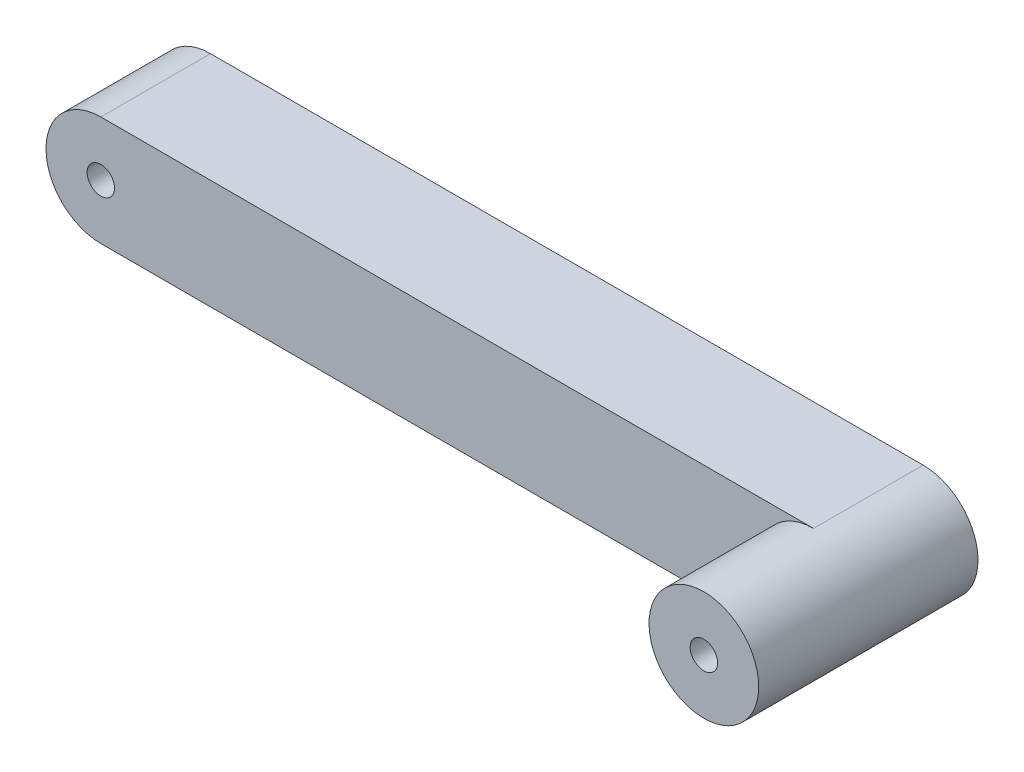
ISO-10303-21;
HEADER;
FILE_DESCRIPTION(('STEP AP214'),'2;1');
FILE_NAME('part.step','',(''),(''),'','','');
FILE_SCHEMA(('AUTOMOTIVE_DESIGN { 1 0 10303 214 1 1 1 1 }'));
ENDSEC;
DATA;
#1=APPLICATION_CONTEXT('core data for automotive mechanical design processes');
#2=APPLICATION_PROTOCOL_DEFINITION('international standard','automotive_design',2000,#1);
#3=PRODUCT_CONTEXT('',#1,'mechanical');
#4=PRODUCT('Part','Part','',(#3));
#5=PRODUCT_RELATED_PRODUCT_CATEGORY('part','',(#4));
#6=PRODUCT_DEFINITION_FORMATION('','',#4);
#7=PRODUCT_DEFINITION_CONTEXT('part definition',#1,'design');
#8=PRODUCT_DEFINITION('design','',#6,#7);
#9=PRODUCT_DEFINITION_SHAPE('','',#8);
#10=(LENGTH_UNIT() NAMED_UNIT(*) SI_UNIT(.MILLI.,.METRE.));
#11=(NAMED_UNIT(*) PLANE_ANGLE_UNIT() SI_UNIT($,.RADIAN.));
#12=(NAMED_UNIT(*) SI_UNIT($,.STERADIAN.) SOLID_ANGLE_UNIT());
#13=UNCERTAINTY_MEASURE_WITH_UNIT(LENGTH_MEASURE(1.E-05),#10,'distance_accuracy_value','');
#14=(GEOMETRIC_REPRESENTATION_CONTEXT(3) GLOBAL_UNCERTAINTY_ASSIGNED_CONTEXT((#13)) GLOBAL_UNIT_ASSIGNED_CONTEXT((#10,
#11,#12)) REPRESENTATION_CONTEXT('',''));
#15=CARTESIAN_POINT('',(0.,0.,0.));
#16=DIRECTION('',(0.,0.,1.));
#17=DIRECTION('',(1.,0.,0.));
#18=AXIS2_PLACEMENT_3D('',#15,#16,#17);
#19=CARTESIAN_POINT('',(0.,0.,4.));
#20=DIRECTION('',(0.,0.,1.));
#21=DIRECTION('',(1.,0.,0.));
#22=AXIS2_PLACEMENT_3D('',#19,#20,#21);
#23=PLANE('',#22);
#24=CARTESIAN_POINT('',(26.,0.,4.));
#25=DIRECTION('',(0.,0.,1.));
#26=DIRECTION('',(1.,0.,0.));
#27=AXIS2_PLACEMENT_3D('',#24,#25,#26);
#28=CIRCLE('',#27,2.);
#29=CARTESIAN_POINT('',(26.,2.,4.));
#30=VERTEX_POINT('',#29);
#31=CARTESIAN_POINT('',(26.,-2.,4.));
#32=VERTEX_POINT('',#31);
#33=EDGE_CURVE('E95',#30,#32,#28,.T.);
#34=ORIENTED_EDGE('',*,*,#33,.F.);
#35=DIRECTION('',(-1.,0.,0.));
#36=VECTOR('',#35,1.);
#37=CARTESIAN_POINT('',(0.,2.,4.));
#38=LINE('',#37,#36);
#39=CARTESIAN_POINT('',(0.,2.,4.));
#40=VERTEX_POINT('',#39);
#41=EDGE_CURVE('E56',#30,#40,#38,.T.);
#42=ORIENTED_EDGE('',*,*,#41,.T.);
#43=CARTESIAN_POINT('',(0.,0.,4.));
#44=DIRECTION('',(0.,0.,1.));
#45=DIRECTION('',(1.,0.,0.));
#46=AXIS2_PLACEMENT_3D('',#43,#44,#45);
#47=CIRCLE('',#46,2.);
#48=CARTESIAN_POINT('',(0.,-2.,4.));
#49=VERTEX_POINT('',#48);
#50=EDGE_CURVE('E116',#40,#49,#47,.T.);
#51=ORIENTED_EDGE('',*,*,#50,.T.);
#52=DIRECTION('',(1.,0.,0.));
#53=VECTOR('',#52,1.);
#54=CARTESIAN_POINT('',(0.,-2.,4.));
#55=LINE('',#54,#53);
#56=EDGE_CURVE('E85',#49,#32,#55,.T.);
#57=ORIENTED_EDGE('',*,*,#56,.T.);
#58=EDGE_LOOP('',(#34,#42,#51,#57));
#59=FACE_BOUND('',#58,.T.);
#60=CARTESIAN_POINT('',(0.,0.,4.));
#61=DIRECTION('',(0.,0.,1.));
#62=DIRECTION('',(1.,0.,0.));
#63=AXIS2_PLACEMENT_3D('',#60,#61,#62);
#64=CIRCLE('',#63,0.5);
#65=CARTESIAN_POINT('',(0.5,0.,4.));
#66=VERTEX_POINT('',#65);
#67=EDGE_CURVE('E110',#66,#66,#64,.T.);
#68=ORIENTED_EDGE('',*,*,#67,.F.);
#69=EDGE_LOOP('',(#68));
#70=FACE_BOUND('',#69,.T.);
#71=ADVANCED_FACE('F39',(#59,#70),#23,.T.);
#72=CARTESIAN_POINT('',(0.,0.,0.));
#73=DIRECTION('',(0.,0.,1.));
#74=DIRECTION('',(1.,0.,0.));
#75=AXIS2_PLACEMENT_3D('',#72,#73,#74);
#76=PLANE('',#75);
#77=CARTESIAN_POINT('',(0.,0.,0.));
#78=DIRECTION('',(0.,0.,1.));
#79=DIRECTION('',(1.,0.,0.));
#80=AXIS2_PLACEMENT_3D('',#77,#78,#79);
#81=CIRCLE('',#80,2.);
#82=CARTESIAN_POINT('',(0.,2.,0.));
#83=VERTEX_POINT('',#82);
#84=CARTESIAN_POINT('',(0.,-2.,0.));
#85=VERTEX_POINT('',#84);
#86=EDGE_CURVE('E113',#83,#85,#81,.T.);
#87=ORIENTED_EDGE('',*,*,#86,.F.);
#88=DIRECTION('',(-1.,0.,0.));
#89=VECTOR('',#88,1.);
#90=CARTESIAN_POINT('',(0.,2.,0.));
#91=LINE('',#90,#89);
#92=CARTESIAN_POINT('',(26.,2.,0.));
#93=VERTEX_POINT('',#92);
#94=EDGE_CURVE('E80',#93,#83,#91,.T.);
#95=ORIENTED_EDGE('',*,*,#94,.F.);
#96=CARTESIAN_POINT('',(26.,0.,0.));
#97=DIRECTION('',(0.,0.,1.));
#98=DIRECTION('',(1.,0.,0.));
#99=AXIS2_PLACEMENT_3D('',#96,#97,#98);
#100=CIRCLE('',#99,2.);
#101=CARTESIAN_POINT('',(26.,-2.,0.));
#102=VERTEX_POINT('',#101);
#103=EDGE_CURVE('E75',#102,#93,#100,.T.);
#104=ORIENTED_EDGE('',*,*,#103,.F.);
#105=DIRECTION('',(1.,0.,0.));
#106=VECTOR('',#105,1.);
#107=CARTESIAN_POINT('',(0.,-2.,0.));
#108=LINE('',#107,#106);
#109=EDGE_CURVE('E121',#85,#102,#108,.T.);
#110=ORIENTED_EDGE('',*,*,#109,.F.);
#111=EDGE_LOOP('',(#87,#95,#104,#110));
#112=FACE_BOUND('',#111,.T.);
#113=CARTESIAN_POINT('',(0.,0.,0.));
#114=DIRECTION('',(0.,0.,1.));
#115=DIRECTION('',(1.,0.,0.));
#116=AXIS2_PLACEMENT_3D('',#113,#114,#115);
#117=CIRCLE('',#116,0.5);
#118=CARTESIAN_POINT('',(0.5,0.,0.));
#119=VERTEX_POINT('',#118);
#120=EDGE_CURVE('E109',#119,#119,#117,.T.);
#121=ORIENTED_EDGE('',*,*,#120,.T.);
#122=EDGE_LOOP('',(#121));
#123=FACE_BOUND('',#122,.T.);
#124=CARTESIAN_POINT('',(26.,0.,0.));
#125=DIRECTION('',(0.,0.,1.));
#126=DIRECTION('',(1.,0.,0.));
#127=AXIS2_PLACEMENT_3D('',#124,#125,#126);
#128=CIRCLE('',#127,0.499999999999999);
#129=CARTESIAN_POINT('',(26.5,0.,0.));
#130=VERTEX_POINT('',#129);
#131=EDGE_CURVE('E102',#130,#130,#128,.T.);
#132=ORIENTED_EDGE('',*,*,#131,.T.);
#133=EDGE_LOOP('',(#132));
#134=FACE_BOUND('',#133,.T.);
#135=ADVANCED_FACE('F127',(#112,#123,#134),#76,.F.);
#136=CARTESIAN_POINT('',(0.,0.,4.));
#137=DIRECTION('',(0.,0.,-1.));
#138=DIRECTION('',(-1.,0.,0.));
#139=AXIS2_PLACEMENT_3D('',#136,#137,#138);
#140=CYLINDRICAL_SURFACE('',#139,2.);
#141=ORIENTED_EDGE('',*,*,#86,.T.);
#142=DIRECTION('',(0.,0.,-1.));
#143=VECTOR('',#142,1.);
#144=CARTESIAN_POINT('',(0.,-2.,4.));
#145=LINE('',#144,#143);
#146=EDGE_CURVE('E11',#49,#85,#145,.T.);
#147=ORIENTED_EDGE('',*,*,#146,.F.);
#148=ORIENTED_EDGE('',*,*,#50,.F.);
#149=DIRECTION('',(0.,0.,-1.));
#150=VECTOR('',#149,1.);
#151=CARTESIAN_POINT('',(0.,2.,4.));
#152=LINE('',#151,#150);
#153=EDGE_CURVE('E89',#40,#83,#152,.T.);
#154=ORIENTED_EDGE('',*,*,#153,.T.);
#155=EDGE_LOOP('',(#141,#147,#148,#154));
#156=FACE_BOUND('',#155,.T.);
#157=ADVANCED_FACE('F41',(#156),#140,.T.);
#158=CARTESIAN_POINT('',(0.,-2.,4.));
#159=DIRECTION('',(0.,1.,0.));
#160=DIRECTION('',(-1.,0.,0.));
#161=AXIS2_PLACEMENT_3D('',#158,#159,#160);
#162=PLANE('',#161);
#163=ORIENTED_EDGE('',*,*,#109,.T.);
#164=DIRECTION('',(0.,0.,-1.));
#165=VECTOR('',#164,1.);
#166=CARTESIAN_POINT('',(26.,-2.,4.));
#167=LINE('',#166,#165);
#168=EDGE_CURVE('E48',#32,#102,#167,.T.);
#169=ORIENTED_EDGE('',*,*,#168,.F.);
#170=ORIENTED_EDGE('',*,*,#56,.F.);
#171=ORIENTED_EDGE('',*,*,#146,.T.);
#172=EDGE_LOOP('',(#163,#169,#170,#171));
#173=FACE_BOUND('',#172,.T.);
#174=ADVANCED_FACE('F131',(#173),#162,.F.);
#175=CARTESIAN_POINT('',(26.,0.,4.));
#176=DIRECTION('',(0.,0.,-1.));
#177=DIRECTION('',(-1.,0.,0.));
#178=AXIS2_PLACEMENT_3D('',#175,#176,#177);
#179=CYLINDRICAL_SURFACE('',#178,2.);
#180=ORIENTED_EDGE('',*,*,#103,.T.);
#181=DIRECTION('',(0.,0.,-1.));
#182=VECTOR('',#181,1.);
#183=CARTESIAN_POINT('',(26.,2.,4.));
#184=LINE('',#183,#182);
#185=EDGE_CURVE('E88',#30,#93,#184,.T.);
#186=ORIENTED_EDGE('',*,*,#185,.F.);
#187=ORIENTED_EDGE('',*,*,#33,.T.);
#188=ORIENTED_EDGE('',*,*,#168,.T.);
#189=EDGE_LOOP('',(#180,#186,#187,#188));
#190=FACE_BOUND('',#189,.T.);
#191=CARTESIAN_POINT('',(26.,0.,8.));
#192=DIRECTION('',(0.,0.,1.));
#193=DIRECTION('',(1.,0.,0.));
#194=AXIS2_PLACEMENT_3D('',#191,#192,#193);
#195=CIRCLE('',#194,2.);
#196=CARTESIAN_POINT('',(28.,0.,8.));
#197=VERTEX_POINT('',#196);
#198=EDGE_CURVE('E98',#197,#197,#195,.T.);
#199=ORIENTED_EDGE('',*,*,#198,.F.);
#200=EDGE_LOOP('',(#199));
#201=FACE_BOUND('',#200,.T.);
#202=ADVANCED_FACE('F93',(#190,#201),#179,.T.);
#203=CARTESIAN_POINT('',(0.,2.,4.));
#204=DIRECTION('',(0.,-1.,0.));
#205=DIRECTION('',(1.,0.,0.));
#206=AXIS2_PLACEMENT_3D('',#203,#204,#205);
#207=PLANE('',#206);
#208=ORIENTED_EDGE('',*,*,#94,.T.);
#209=ORIENTED_EDGE('',*,*,#153,.F.);
#210=ORIENTED_EDGE('',*,*,#41,.F.);
#211=ORIENTED_EDGE('',*,*,#185,.T.);
#212=EDGE_LOOP('',(#208,#209,#210,#211));
#213=FACE_BOUND('',#212,.T.);
#214=ADVANCED_FACE('F87',(#213),#207,.F.);
#215=CARTESIAN_POINT('',(0.,0.,4.));
#216=DIRECTION('',(0.,0.,-1.));
#217=DIRECTION('',(-1.,0.,0.));
#218=AXIS2_PLACEMENT_3D('',#215,#216,#217);
#219=CYLINDRICAL_SURFACE('',#218,0.5);
#220=ORIENTED_EDGE('',*,*,#67,.T.);
#221=EDGE_LOOP('',(#220));
#222=FACE_BOUND('',#221,.T.);
#223=ORIENTED_EDGE('',*,*,#120,.F.);
#224=EDGE_LOOP('',(#223));
#225=FACE_BOUND('',#224,.T.);
#226=ADVANCED_FACE('F145',(#222,#225),#219,.F.);
#227=CARTESIAN_POINT('',(26.,0.,4.));
#228=DIRECTION('',(0.,0.,-1.));
#229=DIRECTION('',(-1.,0.,0.));
#230=AXIS2_PLACEMENT_3D('',#227,#228,#229);
#231=CYLINDRICAL_SURFACE('',#230,0.499999999999999);
#232=ORIENTED_EDGE('',*,*,#131,.F.);
#233=EDGE_LOOP('',(#232));
#234=FACE_BOUND('',#233,.T.);
#235=CARTESIAN_POINT('',(26.,0.,8.));
#236=DIRECTION('',(0.,0.,1.));
#237=DIRECTION('',(1.,0.,0.));
#238=AXIS2_PLACEMENT_3D('',#235,#236,#237);
#239=CIRCLE('',#238,0.499999999999999);
#240=CARTESIAN_POINT('',(26.5,0.,8.));
#241=VERTEX_POINT('',#240);
#242=EDGE_CURVE('E99',#241,#241,#239,.T.);
#243=ORIENTED_EDGE('',*,*,#242,.T.);
#244=EDGE_LOOP('',(#243));
#245=FACE_BOUND('',#244,.T.);
#246=ADVANCED_FACE('F152',(#234,#245),#231,.F.);
#247=CARTESIAN_POINT('',(26.,0.,8.));
#248=DIRECTION('',(0.,0.,1.));
#249=DIRECTION('',(1.,0.,0.));
#250=AXIS2_PLACEMENT_3D('',#247,#248,#249);
#251=PLANE('',#250);
#252=ORIENTED_EDGE('',*,*,#198,.T.);
#253=EDGE_LOOP('',(#252));
#254=FACE_BOUND('',#253,.T.);
#255=ORIENTED_EDGE('',*,*,#242,.F.);
#256=EDGE_LOOP('',(#255));
#257=FACE_BOUND('',#256,.T.);
#258=ADVANCED_FACE('F157',(#254,#257),#251,.T.);
#259=CLOSED_SHELL('',(#71,#135,#157,#174,#202,#214,#226,#246,#258));
#260=MANIFOLD_SOLID_BREP('B2',#259);
#261=ADVANCED_BREP_SHAPE_REPRESENTATION('',(#18,#260),#14);
#262=SHAPE_DEFINITION_REPRESENTATION(#9,#261);
ENDSEC;
END-ISO-10303-21;
